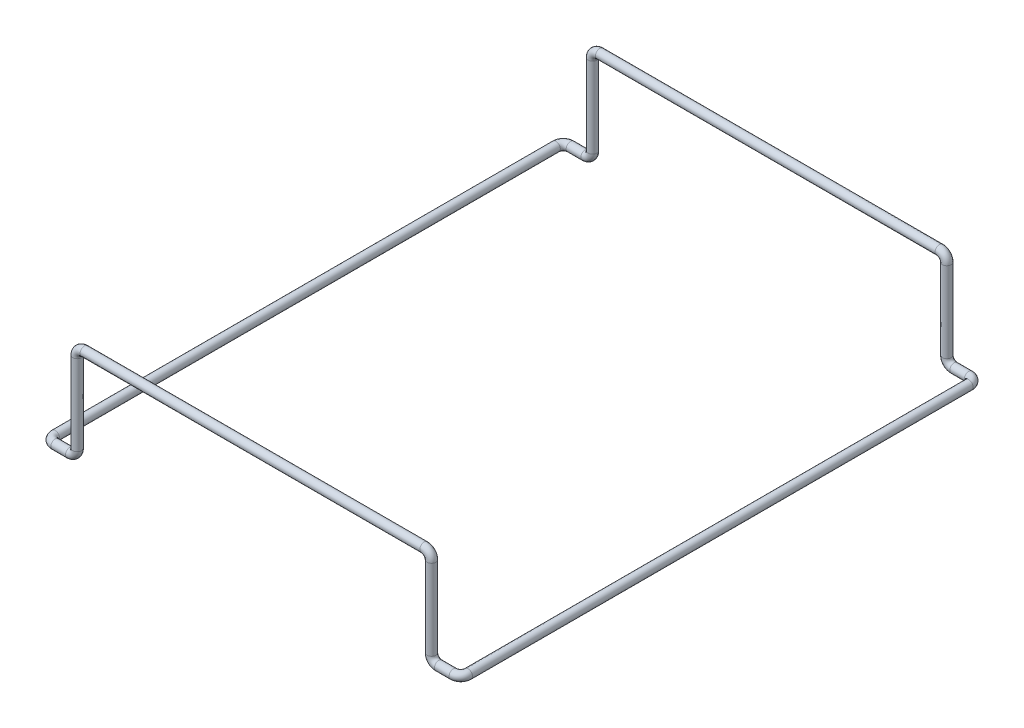
ISO-10303-21;
HEADER;
FILE_DESCRIPTION(('STEP AP214'),'2;1');
FILE_NAME('part.step','',(''),(''),'','','');
FILE_SCHEMA(('AUTOMOTIVE_DESIGN { 1 0 10303 214 1 1 1 1 }'));
ENDSEC;
DATA;
#1=APPLICATION_CONTEXT('core data for automotive mechanical design processes');
#2=APPLICATION_PROTOCOL_DEFINITION('international standard','automotive_design',2000,#1);
#3=PRODUCT_CONTEXT('',#1,'mechanical');
#4=PRODUCT('Part','Part','',(#3));
#5=PRODUCT_RELATED_PRODUCT_CATEGORY('part','',(#4));
#6=PRODUCT_DEFINITION_FORMATION('','',#4);
#7=PRODUCT_DEFINITION_CONTEXT('part definition',#1,'design');
#8=PRODUCT_DEFINITION('design','',#6,#7);
#9=PRODUCT_DEFINITION_SHAPE('','',#8);
#10=(LENGTH_UNIT() NAMED_UNIT(*) SI_UNIT(.MILLI.,.METRE.));
#11=(NAMED_UNIT(*) PLANE_ANGLE_UNIT() SI_UNIT($,.RADIAN.));
#12=(NAMED_UNIT(*) SI_UNIT($,.STERADIAN.) SOLID_ANGLE_UNIT());
#13=UNCERTAINTY_MEASURE_WITH_UNIT(LENGTH_MEASURE(1.E-05),#10,'distance_accuracy_value','');
#14=(GEOMETRIC_REPRESENTATION_CONTEXT(3) GLOBAL_UNCERTAINTY_ASSIGNED_CONTEXT((#13)) GLOBAL_UNIT_ASSIGNED_CONTEXT((#10,
#11,#12)) REPRESENTATION_CONTEXT('',''));
#15=CARTESIAN_POINT('',(0.,0.,0.));
#16=DIRECTION('',(0.,0.,1.));
#17=DIRECTION('',(1.,0.,0.));
#18=AXIS2_PLACEMENT_3D('',#15,#16,#17);
#19=CARTESIAN_POINT('',(282.,-1.3917721026699E-13,347.));
#20=DIRECTION('',(0.,0.,-1.));
#21=DIRECTION('',(0.,1.,0.));
#22=AXIS2_PLACEMENT_3D('',#19,#20,#21);
#23=CYLINDRICAL_SURFACE('',#22,2.99999999999999);
#24=CARTESIAN_POINT('',(282.,0.,5.));
#25=DIRECTION('',(0.,0.,-1.));
#26=DIRECTION('',(-1.,0.,0.));
#27=AXIS2_PLACEMENT_3D('',#24,#25,#26);
#28=CIRCLE('',#27,2.99999999999999);
#29=CARTESIAN_POINT('',(285.,0.,5.00000000000001));
#30=VERTEX_POINT('',#29);
#31=EDGE_CURVE('E138',#30,#30,#28,.T.);
#32=ORIENTED_EDGE('',*,*,#31,.F.);
#33=EDGE_LOOP('',(#32));
#34=FACE_BOUND('',#33,.T.);
#35=CARTESIAN_POINT('',(282.,0.,347.));
#36=DIRECTION('',(0.,0.,-1.));
#37=DIRECTION('',(-1.,0.,0.));
#38=AXIS2_PLACEMENT_3D('',#35,#36,#37);
#39=CIRCLE('',#38,2.99999999999999);
#40=CARTESIAN_POINT('',(285.,0.,347.));
#41=VERTEX_POINT('',#40);
#42=EDGE_CURVE('E10',#41,#41,#39,.T.);
#43=ORIENTED_EDGE('',*,*,#42,.T.);
#44=EDGE_LOOP('',(#43));
#45=FACE_BOUND('',#44,.T.);
#46=ADVANCED_FACE('F38',(#34,#45),#23,.T.);
#47=CARTESIAN_POINT('',(277.,0.,347.));
#48=DIRECTION('',(0.,1.,0.));
#49=DIRECTION('',(0.,0.,1.));
#50=AXIS2_PLACEMENT_3D('',#47,#48,#49);
#51=TOROIDAL_SURFACE('',#50,5.,2.99999999999999);
#52=CARTESIAN_POINT('',(277.,0.,352.));
#53=DIRECTION('',(1.,0.,0.));
#54=DIRECTION('',(0.,0.,-1.));
#55=AXIS2_PLACEMENT_3D('',#52,#53,#54);
#56=CIRCLE('',#55,2.99999999999999);
#57=CARTESIAN_POINT('',(277.,-1.42859144850817E-13,355.));
#58=VERTEX_POINT('',#57);
#59=EDGE_CURVE('E45',#58,#58,#56,.T.);
#60=CARTESIAN_POINT('',(277.,0.,347.));
#61=DIRECTION('',(0.,1.,0.));
#62=DIRECTION('',(0.,0.,1.));
#63=AXIS2_PLACEMENT_3D('',#60,#61,#62);
#64=CIRCLE('',#63,8.);
#65=EDGE_CURVE('',#58,#41,#64,.T.);
#66=ORIENTED_EDGE('',*,*,#59,.T.);
#67=ORIENTED_EDGE('',*,*,#42,.F.);
#68=ORIENTED_EDGE('',*,*,#65,.T.);
#69=ORIENTED_EDGE('',*,*,#65,.F.);
#70=EDGE_LOOP('',(#66,#68,#67,#69));
#71=FACE_BOUND('',#70,.T.);
#72=ADVANCED_FACE('F145',(#71),#51,.T.);
#73=CARTESIAN_POINT('',(267.,0.,352.));
#74=DIRECTION('',(1.,0.,0.));
#75=DIRECTION('',(0.,1.,0.));
#76=AXIS2_PLACEMENT_3D('',#73,#74,#75);
#77=CYLINDRICAL_SURFACE('',#76,2.99999999999999);
#78=ORIENTED_EDGE('',*,*,#59,.F.);
#79=EDGE_LOOP('',(#78));
#80=FACE_BOUND('',#79,.T.);
#81=CARTESIAN_POINT('',(267.,0.,352.));
#82=DIRECTION('',(1.,0.,0.));
#83=DIRECTION('',(0.,0.,-1.));
#84=AXIS2_PLACEMENT_3D('',#81,#82,#83);
#85=CIRCLE('',#84,2.99999999999999);
#86=CARTESIAN_POINT('',(267.,-3.00000000000005,352.));
#87=VERTEX_POINT('',#86);
#88=EDGE_CURVE('E51',#87,#87,#85,.T.);
#89=ORIENTED_EDGE('',*,*,#88,.T.);
#90=EDGE_LOOP('',(#89));
#91=FACE_BOUND('',#90,.T.);
#92=ADVANCED_FACE('F149',(#80,#91),#77,.T.);
#93=CARTESIAN_POINT('',(267.,5.,352.));
#94=DIRECTION('',(0.,0.,1.));
#95=DIRECTION('',(1.,0.,0.));
#96=AXIS2_PLACEMENT_3D('',#93,#94,#95);
#97=TOROIDAL_SURFACE('',#96,5.00000000000006,2.99999999999999);
#98=CARTESIAN_POINT('',(262.,5.,352.));
#99=DIRECTION('',(0.,-1.,0.));
#100=DIRECTION('',(0.,0.,-1.));
#101=AXIS2_PLACEMENT_3D('',#98,#99,#100);
#102=CIRCLE('',#101,2.99999999999999);
#103=CARTESIAN_POINT('',(259.,5.,352.));
#104=VERTEX_POINT('',#103);
#105=EDGE_CURVE('E58',#104,#104,#102,.T.);
#106=CARTESIAN_POINT('',(267.,5.,352.));
#107=DIRECTION('',(0.,0.,1.));
#108=DIRECTION('',(1.,0.,0.));
#109=AXIS2_PLACEMENT_3D('',#106,#107,#108);
#110=CIRCLE('',#109,8.00000000000005);
#111=EDGE_CURVE('',#104,#87,#110,.T.);
#112=ORIENTED_EDGE('',*,*,#105,.T.);
#113=ORIENTED_EDGE('',*,*,#88,.F.);
#114=ORIENTED_EDGE('',*,*,#111,.T.);
#115=ORIENTED_EDGE('',*,*,#111,.F.);
#116=EDGE_LOOP('',(#112,#114,#113,#115));
#117=FACE_BOUND('',#116,.T.);
#118=ADVANCED_FACE('F154',(#117),#97,.T.);
#119=CARTESIAN_POINT('',(262.,60.,352.));
#120=DIRECTION('',(0.,-1.,0.));
#121=DIRECTION('',(0.,0.,-1.));
#122=AXIS2_PLACEMENT_3D('',#119,#120,#121);
#123=CYLINDRICAL_SURFACE('',#122,2.99999999999999);
#124=ORIENTED_EDGE('',*,*,#105,.F.);
#125=EDGE_LOOP('',(#124));
#126=FACE_BOUND('',#125,.T.);
#127=CARTESIAN_POINT('',(262.,60.,352.));
#128=DIRECTION('',(0.,-1.,0.));
#129=DIRECTION('',(0.,0.,-1.));
#130=AXIS2_PLACEMENT_3D('',#127,#128,#129);
#131=CIRCLE('',#130,2.99999999999999);
#132=CARTESIAN_POINT('',(265.,60.,352.));
#133=VERTEX_POINT('',#132);
#134=EDGE_CURVE('E64',#133,#133,#131,.T.);
#135=ORIENTED_EDGE('',*,*,#134,.T.);
#136=EDGE_LOOP('',(#135));
#137=FACE_BOUND('',#136,.T.);
#138=ADVANCED_FACE('F160',(#126,#137),#123,.T.);
#139=CARTESIAN_POINT('',(257.,60.,352.));
#140=DIRECTION('',(0.,0.,-1.));
#141=DIRECTION('',(-1.,0.,0.));
#142=AXIS2_PLACEMENT_3D('',#139,#140,#141);
#143=TOROIDAL_SURFACE('',#142,4.9999999999999,2.99999999999999);
#144=CARTESIAN_POINT('',(257.,64.9999999999999,352.));
#145=DIRECTION('',(1.,0.,0.));
#146=DIRECTION('',(0.,0.,-1.));
#147=AXIS2_PLACEMENT_3D('',#144,#145,#146);
#148=CIRCLE('',#147,2.99999999999999);
#149=CARTESIAN_POINT('',(257.,67.9999999999999,352.));
#150=VERTEX_POINT('',#149);
#151=EDGE_CURVE('E68',#150,#150,#148,.T.);
#152=CARTESIAN_POINT('',(257.,60.,352.));
#153=DIRECTION('',(0.,0.,-1.));
#154=DIRECTION('',(-1.,0.,0.));
#155=AXIS2_PLACEMENT_3D('',#152,#153,#154);
#156=CIRCLE('',#155,7.99999999999989);
#157=EDGE_CURVE('',#150,#133,#156,.T.);
#158=ORIENTED_EDGE('',*,*,#151,.T.);
#159=ORIENTED_EDGE('',*,*,#134,.F.);
#160=ORIENTED_EDGE('',*,*,#157,.T.);
#161=ORIENTED_EDGE('',*,*,#157,.F.);
#162=EDGE_LOOP('',(#158,#160,#159,#161));
#163=FACE_BOUND('',#162,.T.);
#164=ADVANCED_FACE('F164',(#163),#143,.T.);
#165=CARTESIAN_POINT('',(25.,64.9999999999999,352.));
#166=DIRECTION('',(1.,0.,0.));
#167=DIRECTION('',(0.,0.,-1.));
#168=AXIS2_PLACEMENT_3D('',#165,#166,#167);
#169=CYLINDRICAL_SURFACE('',#168,2.99999999999999);
#170=ORIENTED_EDGE('',*,*,#151,.F.);
#171=EDGE_LOOP('',(#170));
#172=FACE_BOUND('',#171,.T.);
#173=CARTESIAN_POINT('',(25.,64.9999999999999,352.));
#174=DIRECTION('',(1.,0.,0.));
#175=DIRECTION('',(0.,0.,-1.));
#176=AXIS2_PLACEMENT_3D('',#173,#174,#175);
#177=CIRCLE('',#176,2.99999999999999);
#178=CARTESIAN_POINT('',(25.,67.9999999999999,352.));
#179=VERTEX_POINT('',#178);
#180=EDGE_CURVE('E72',#179,#179,#177,.T.);
#181=ORIENTED_EDGE('',*,*,#180,.T.);
#182=EDGE_LOOP('',(#181));
#183=FACE_BOUND('',#182,.T.);
#184=ADVANCED_FACE('F168',(#172,#183),#169,.T.);
#185=CARTESIAN_POINT('',(25.,60.,352.));
#186=DIRECTION('',(0.,0.,-1.));
#187=DIRECTION('',(-1.,0.,0.));
#188=AXIS2_PLACEMENT_3D('',#185,#186,#187);
#189=TOROIDAL_SURFACE('',#188,4.9999999999999,2.99999999999999);
#190=CARTESIAN_POINT('',(20.0000000000001,60.,352.));
#191=DIRECTION('',(0.,1.,0.));
#192=DIRECTION('',(0.,0.,-1.));
#193=AXIS2_PLACEMENT_3D('',#190,#191,#192);
#194=CIRCLE('',#193,2.99999999999999);
#195=CARTESIAN_POINT('',(17.0000000000001,60.,352.));
#196=VERTEX_POINT('',#195);
#197=EDGE_CURVE('E76',#196,#196,#194,.T.);
#198=CARTESIAN_POINT('',(25.,60.,352.));
#199=DIRECTION('',(0.,0.,-1.));
#200=DIRECTION('',(-1.,0.,0.));
#201=AXIS2_PLACEMENT_3D('',#198,#199,#200);
#202=CIRCLE('',#201,7.99999999999989);
#203=EDGE_CURVE('',#196,#179,#202,.T.);
#204=ORIENTED_EDGE('',*,*,#197,.T.);
#205=ORIENTED_EDGE('',*,*,#180,.F.);
#206=ORIENTED_EDGE('',*,*,#203,.T.);
#207=ORIENTED_EDGE('',*,*,#203,.F.);
#208=EDGE_LOOP('',(#204,#206,#205,#207));
#209=FACE_BOUND('',#208,.T.);
#210=ADVANCED_FACE('F172',(#209),#189,.T.);
#211=CARTESIAN_POINT('',(20.0000000000001,5.,352.));
#212=DIRECTION('',(0.,1.,0.));
#213=DIRECTION('',(0.,0.,1.));
#214=AXIS2_PLACEMENT_3D('',#211,#212,#213);
#215=CYLINDRICAL_SURFACE('',#214,2.99999999999999);
#216=ORIENTED_EDGE('',*,*,#197,.F.);
#217=EDGE_LOOP('',(#216));
#218=FACE_BOUND('',#217,.T.);
#219=CARTESIAN_POINT('',(20.0000000000001,5.,352.));
#220=DIRECTION('',(0.,1.,0.));
#221=DIRECTION('',(0.,0.,-1.));
#222=AXIS2_PLACEMENT_3D('',#219,#220,#221);
#223=CIRCLE('',#222,2.99999999999999);
#224=CARTESIAN_POINT('',(23.0000000000001,5.,352.));
#225=VERTEX_POINT('',#224);
#226=EDGE_CURVE('E80',#225,#225,#223,.T.);
#227=ORIENTED_EDGE('',*,*,#226,.T.);
#228=EDGE_LOOP('',(#227));
#229=FACE_BOUND('',#228,.T.);
#230=ADVANCED_FACE('F176',(#218,#229),#215,.T.);
#231=CARTESIAN_POINT('',(15.,5.,352.));
#232=DIRECTION('',(0.,0.,1.));
#233=DIRECTION('',(1.,0.,0.));
#234=AXIS2_PLACEMENT_3D('',#231,#232,#233);
#235=TOROIDAL_SURFACE('',#234,5.0000000000001,2.99999999999999);
#236=CARTESIAN_POINT('',(15.,0.,352.));
#237=DIRECTION('',(1.,0.,0.));
#238=DIRECTION('',(0.,0.,-1.));
#239=AXIS2_PLACEMENT_3D('',#236,#237,#238);
#240=CIRCLE('',#239,2.99999999999999);
#241=CARTESIAN_POINT('',(15.,-3.00000000000009,352.));
#242=VERTEX_POINT('',#241);
#243=EDGE_CURVE('E84',#242,#242,#240,.T.);
#244=CARTESIAN_POINT('',(15.,5.,352.));
#245=DIRECTION('',(0.,0.,1.));
#246=DIRECTION('',(1.,0.,0.));
#247=AXIS2_PLACEMENT_3D('',#244,#245,#246);
#248=CIRCLE('',#247,8.00000000000009);
#249=EDGE_CURVE('',#242,#225,#248,.T.);
#250=ORIENTED_EDGE('',*,*,#243,.T.);
#251=ORIENTED_EDGE('',*,*,#226,.F.);
#252=ORIENTED_EDGE('',*,*,#249,.T.);
#253=ORIENTED_EDGE('',*,*,#249,.F.);
#254=EDGE_LOOP('',(#250,#252,#251,#253));
#255=FACE_BOUND('',#254,.T.);
#256=ADVANCED_FACE('F180',(#255),#235,.T.);
#257=CARTESIAN_POINT('',(5.,0.,352.));
#258=DIRECTION('',(1.,0.,0.));
#259=DIRECTION('',(0.,0.,-1.));
#260=AXIS2_PLACEMENT_3D('',#257,#258,#259);
#261=CYLINDRICAL_SURFACE('',#260,2.99999999999999);
#262=ORIENTED_EDGE('',*,*,#243,.F.);
#263=EDGE_LOOP('',(#262));
#264=FACE_BOUND('',#263,.T.);
#265=CARTESIAN_POINT('',(5.,0.,352.));
#266=DIRECTION('',(1.,0.,0.));
#267=DIRECTION('',(0.,0.,-1.));
#268=AXIS2_PLACEMENT_3D('',#265,#266,#267);
#269=CIRCLE('',#268,2.99999999999999);
#270=CARTESIAN_POINT('',(5.,0.,355.));
#271=VERTEX_POINT('',#270);
#272=EDGE_CURVE('E88',#271,#271,#269,.T.);
#273=ORIENTED_EDGE('',*,*,#272,.T.);
#274=EDGE_LOOP('',(#273));
#275=FACE_BOUND('',#274,.T.);
#276=ADVANCED_FACE('F184',(#264,#275),#261,.T.);
#277=CARTESIAN_POINT('',(5.,0.,347.));
#278=DIRECTION('',(0.,1.,0.));
#279=DIRECTION('',(0.,0.,1.));
#280=AXIS2_PLACEMENT_3D('',#277,#278,#279);
#281=TOROIDAL_SURFACE('',#280,5.,2.99999999999999);
#282=CARTESIAN_POINT('',(0.,0.,347.));
#283=DIRECTION('',(0.,0.,1.));
#284=DIRECTION('',(1.,0.,0.));
#285=AXIS2_PLACEMENT_3D('',#282,#283,#284);
#286=CIRCLE('',#285,2.99999999999999);
#287=CARTESIAN_POINT('',(-2.99999999999999,0.,347.));
#288=VERTEX_POINT('',#287);
#289=EDGE_CURVE('E92',#288,#288,#286,.T.);
#290=CARTESIAN_POINT('',(5.,0.,347.));
#291=DIRECTION('',(0.,1.,0.));
#292=DIRECTION('',(0.,0.,1.));
#293=AXIS2_PLACEMENT_3D('',#290,#291,#292);
#294=CIRCLE('',#293,7.99999999999999);
#295=EDGE_CURVE('',#288,#271,#294,.T.);
#296=ORIENTED_EDGE('',*,*,#289,.T.);
#297=ORIENTED_EDGE('',*,*,#272,.F.);
#298=ORIENTED_EDGE('',*,*,#295,.T.);
#299=ORIENTED_EDGE('',*,*,#295,.F.);
#300=EDGE_LOOP('',(#296,#298,#297,#299));
#301=FACE_BOUND('',#300,.T.);
#302=ADVANCED_FACE('F188',(#301),#281,.T.);
#303=CARTESIAN_POINT('',(0.,0.,5.));
#304=DIRECTION('',(0.,0.,1.));
#305=DIRECTION('',(1.,0.,0.));
#306=AXIS2_PLACEMENT_3D('',#303,#304,#305);
#307=CYLINDRICAL_SURFACE('',#306,2.99999999999999);
#308=ORIENTED_EDGE('',*,*,#289,.F.);
#309=EDGE_LOOP('',(#308));
#310=FACE_BOUND('',#309,.T.);
#311=CARTESIAN_POINT('',(0.,0.,5.));
#312=DIRECTION('',(0.,0.,1.));
#313=DIRECTION('',(1.,0.,0.));
#314=AXIS2_PLACEMENT_3D('',#311,#312,#313);
#315=CIRCLE('',#314,2.99999999999999);
#316=CARTESIAN_POINT('',(-2.99999999999999,0.,5.));
#317=VERTEX_POINT('',#316);
#318=EDGE_CURVE('E96',#317,#317,#315,.T.);
#319=ORIENTED_EDGE('',*,*,#318,.T.);
#320=EDGE_LOOP('',(#319));
#321=FACE_BOUND('',#320,.T.);
#322=ADVANCED_FACE('F192',(#310,#321),#307,.T.);
#323=CARTESIAN_POINT('',(5.,0.,5.));
#324=DIRECTION('',(0.,1.,0.));
#325=DIRECTION('',(0.,0.,1.));
#326=AXIS2_PLACEMENT_3D('',#323,#324,#325);
#327=TOROIDAL_SURFACE('',#326,5.,2.99999999999999);
#328=CARTESIAN_POINT('',(5.,0.,0.));
#329=DIRECTION('',(-1.,0.,0.));
#330=DIRECTION('',(0.,0.,1.));
#331=AXIS2_PLACEMENT_3D('',#328,#329,#330);
#332=CIRCLE('',#331,2.99999999999999);
#333=CARTESIAN_POINT('',(5.,0.,-2.99999999999999));
#334=VERTEX_POINT('',#333);
#335=EDGE_CURVE('E100',#334,#334,#332,.T.);
#336=CARTESIAN_POINT('',(5.,0.,5.));
#337=DIRECTION('',(0.,1.,0.));
#338=DIRECTION('',(0.,0.,1.));
#339=AXIS2_PLACEMENT_3D('',#336,#337,#338);
#340=CIRCLE('',#339,7.99999999999999);
#341=EDGE_CURVE('',#334,#317,#340,.T.);
#342=ORIENTED_EDGE('',*,*,#335,.T.);
#343=ORIENTED_EDGE('',*,*,#318,.F.);
#344=ORIENTED_EDGE('',*,*,#341,.T.);
#345=ORIENTED_EDGE('',*,*,#341,.F.);
#346=EDGE_LOOP('',(#342,#344,#343,#345));
#347=FACE_BOUND('',#346,.T.);
#348=ADVANCED_FACE('F196',(#347),#327,.T.);
#349=CARTESIAN_POINT('',(15.,0.,0.));
#350=DIRECTION('',(-1.,0.,0.));
#351=DIRECTION('',(0.,0.,1.));
#352=AXIS2_PLACEMENT_3D('',#349,#350,#351);
#353=CYLINDRICAL_SURFACE('',#352,2.99999999999999);
#354=ORIENTED_EDGE('',*,*,#335,.F.);
#355=EDGE_LOOP('',(#354));
#356=FACE_BOUND('',#355,.T.);
#357=CARTESIAN_POINT('',(15.,0.,0.));
#358=DIRECTION('',(-1.,0.,0.));
#359=DIRECTION('',(0.,0.,1.));
#360=AXIS2_PLACEMENT_3D('',#357,#358,#359);
#361=CIRCLE('',#360,2.99999999999999);
#362=CARTESIAN_POINT('',(15.,-3.00000000000009,0.));
#363=VERTEX_POINT('',#362);
#364=EDGE_CURVE('E104',#363,#363,#361,.T.);
#365=ORIENTED_EDGE('',*,*,#364,.T.);
#366=EDGE_LOOP('',(#365));
#367=FACE_BOUND('',#366,.T.);
#368=ADVANCED_FACE('F200',(#356,#367),#353,.T.);
#369=CARTESIAN_POINT('',(15.,5.,0.));
#370=DIRECTION('',(0.,0.,-1.));
#371=DIRECTION('',(-1.,0.,0.));
#372=AXIS2_PLACEMENT_3D('',#369,#370,#371);
#373=TOROIDAL_SURFACE('',#372,5.0000000000001,2.99999999999999);
#374=CARTESIAN_POINT('',(20.0000000000001,5.,0.));
#375=DIRECTION('',(0.,-1.,0.));
#376=DIRECTION('',(0.,0.,1.));
#377=AXIS2_PLACEMENT_3D('',#374,#375,#376);
#378=CIRCLE('',#377,2.99999999999999);
#379=CARTESIAN_POINT('',(23.0000000000001,5.,0.));
#380=VERTEX_POINT('',#379);
#381=EDGE_CURVE('E108',#380,#380,#378,.T.);
#382=CARTESIAN_POINT('',(15.,5.,0.));
#383=DIRECTION('',(0.,0.,-1.));
#384=DIRECTION('',(-1.,0.,0.));
#385=AXIS2_PLACEMENT_3D('',#382,#383,#384);
#386=CIRCLE('',#385,8.00000000000009);
#387=EDGE_CURVE('',#380,#363,#386,.T.);
#388=ORIENTED_EDGE('',*,*,#381,.T.);
#389=ORIENTED_EDGE('',*,*,#364,.F.);
#390=ORIENTED_EDGE('',*,*,#387,.T.);
#391=ORIENTED_EDGE('',*,*,#387,.F.);
#392=EDGE_LOOP('',(#388,#390,#389,#391));
#393=FACE_BOUND('',#392,.T.);
#394=ADVANCED_FACE('F204',(#393),#373,.T.);
#395=CARTESIAN_POINT('',(20.0000000000001,60.,0.));
#396=DIRECTION('',(0.,-1.,0.));
#397=DIRECTION('',(0.,0.,-1.));
#398=AXIS2_PLACEMENT_3D('',#395,#396,#397);
#399=CYLINDRICAL_SURFACE('',#398,2.99999999999999);
#400=ORIENTED_EDGE('',*,*,#381,.F.);
#401=EDGE_LOOP('',(#400));
#402=FACE_BOUND('',#401,.T.);
#403=CARTESIAN_POINT('',(20.0000000000001,60.,0.));
#404=DIRECTION('',(0.,-1.,0.));
#405=DIRECTION('',(0.,0.,1.));
#406=AXIS2_PLACEMENT_3D('',#403,#404,#405);
#407=CIRCLE('',#406,2.99999999999999);
#408=CARTESIAN_POINT('',(17.0000000000001,60.,0.));
#409=VERTEX_POINT('',#408);
#410=EDGE_CURVE('E112',#409,#409,#407,.T.);
#411=ORIENTED_EDGE('',*,*,#410,.T.);
#412=EDGE_LOOP('',(#411));
#413=FACE_BOUND('',#412,.T.);
#414=ADVANCED_FACE('F208',(#402,#413),#399,.T.);
#415=CARTESIAN_POINT('',(25.,60.,0.));
#416=DIRECTION('',(0.,0.,1.));
#417=DIRECTION('',(1.,0.,0.));
#418=AXIS2_PLACEMENT_3D('',#415,#416,#417);
#419=TOROIDAL_SURFACE('',#418,4.9999999999999,2.99999999999999);
#420=CARTESIAN_POINT('',(25.,64.9999999999999,0.));
#421=DIRECTION('',(-1.,0.,0.));
#422=DIRECTION('',(0.,0.,1.));
#423=AXIS2_PLACEMENT_3D('',#420,#421,#422);
#424=CIRCLE('',#423,2.99999999999999);
#425=CARTESIAN_POINT('',(25.,67.9999999999999,0.));
#426=VERTEX_POINT('',#425);
#427=EDGE_CURVE('E115',#426,#426,#424,.T.);
#428=CARTESIAN_POINT('',(25.,60.,0.));
#429=DIRECTION('',(0.,0.,1.));
#430=DIRECTION('',(1.,0.,0.));
#431=AXIS2_PLACEMENT_3D('',#428,#429,#430);
#432=CIRCLE('',#431,7.99999999999989);
#433=EDGE_CURVE('',#426,#409,#432,.T.);
#434=ORIENTED_EDGE('',*,*,#427,.T.);
#435=ORIENTED_EDGE('',*,*,#410,.F.);
#436=ORIENTED_EDGE('',*,*,#433,.T.);
#437=ORIENTED_EDGE('',*,*,#433,.F.);
#438=EDGE_LOOP('',(#434,#436,#435,#437));
#439=FACE_BOUND('',#438,.T.);
#440=ADVANCED_FACE('F212',(#439),#419,.T.);
#441=CARTESIAN_POINT('',(257.,64.9999999999999,0.));
#442=DIRECTION('',(-1.,0.,0.));
#443=DIRECTION('',(0.,0.,1.));
#444=AXIS2_PLACEMENT_3D('',#441,#442,#443);
#445=CYLINDRICAL_SURFACE('',#444,2.99999999999999);
#446=ORIENTED_EDGE('',*,*,#427,.F.);
#447=EDGE_LOOP('',(#446));
#448=FACE_BOUND('',#447,.T.);
#449=CARTESIAN_POINT('',(257.,64.9999999999999,0.));
#450=DIRECTION('',(-1.,0.,0.));
#451=DIRECTION('',(0.,0.,1.));
#452=AXIS2_PLACEMENT_3D('',#449,#450,#451);
#453=CIRCLE('',#452,2.99999999999999);
#454=CARTESIAN_POINT('',(257.,67.9999999999999,0.));
#455=VERTEX_POINT('',#454);
#456=EDGE_CURVE('E119',#455,#455,#453,.T.);
#457=ORIENTED_EDGE('',*,*,#456,.T.);
#458=EDGE_LOOP('',(#457));
#459=FACE_BOUND('',#458,.T.);
#460=ADVANCED_FACE('F216',(#448,#459),#445,.T.);
#461=CARTESIAN_POINT('',(257.,60.,0.));
#462=DIRECTION('',(0.,0.,1.));
#463=DIRECTION('',(1.,0.,0.));
#464=AXIS2_PLACEMENT_3D('',#461,#462,#463);
#465=TOROIDAL_SURFACE('',#464,4.99999999999995,2.99999999999999);
#466=CARTESIAN_POINT('',(262.,60.,0.));
#467=DIRECTION('',(0.,1.,0.));
#468=DIRECTION('',(0.,0.,1.));
#469=AXIS2_PLACEMENT_3D('',#466,#467,#468);
#470=CIRCLE('',#469,2.99999999999999);
#471=CARTESIAN_POINT('',(265.,60.,0.));
#472=VERTEX_POINT('',#471);
#473=EDGE_CURVE('E122',#472,#472,#470,.T.);
#474=CARTESIAN_POINT('',(257.,60.,0.));
#475=DIRECTION('',(0.,0.,1.));
#476=DIRECTION('',(1.,0.,0.));
#477=AXIS2_PLACEMENT_3D('',#474,#475,#476);
#478=CIRCLE('',#477,7.99999999999994);
#479=EDGE_CURVE('',#472,#455,#478,.T.);
#480=ORIENTED_EDGE('',*,*,#473,.T.);
#481=ORIENTED_EDGE('',*,*,#456,.F.);
#482=ORIENTED_EDGE('',*,*,#479,.T.);
#483=ORIENTED_EDGE('',*,*,#479,.F.);
#484=EDGE_LOOP('',(#480,#482,#481,#483));
#485=FACE_BOUND('',#484,.T.);
#486=ADVANCED_FACE('F220',(#485),#465,.T.);
#487=CARTESIAN_POINT('',(262.,5.,0.));
#488=DIRECTION('',(0.,1.,0.));
#489=DIRECTION('',(0.,0.,1.));
#490=AXIS2_PLACEMENT_3D('',#487,#488,#489);
#491=CYLINDRICAL_SURFACE('',#490,2.99999999999999);
#492=ORIENTED_EDGE('',*,*,#473,.F.);
#493=EDGE_LOOP('',(#492));
#494=FACE_BOUND('',#493,.T.);
#495=CARTESIAN_POINT('',(262.,5.,0.));
#496=DIRECTION('',(0.,1.,0.));
#497=DIRECTION('',(0.,0.,1.));
#498=AXIS2_PLACEMENT_3D('',#495,#496,#497);
#499=CIRCLE('',#498,2.99999999999999);
#500=CARTESIAN_POINT('',(259.,4.99999999999999,0.));
#501=VERTEX_POINT('',#500);
#502=EDGE_CURVE('E126',#501,#501,#499,.T.);
#503=ORIENTED_EDGE('',*,*,#502,.T.);
#504=EDGE_LOOP('',(#503));
#505=FACE_BOUND('',#504,.T.);
#506=ADVANCED_FACE('F224',(#494,#505),#491,.T.);
#507=CARTESIAN_POINT('',(267.,5.,0.));
#508=DIRECTION('',(0.,0.,-1.));
#509=DIRECTION('',(-1.,0.,0.));
#510=AXIS2_PLACEMENT_3D('',#507,#508,#509);
#511=TOROIDAL_SURFACE('',#510,5.0000000000001,2.99999999999999);
#512=CARTESIAN_POINT('',(267.,0.,0.));
#513=DIRECTION('',(-1.,0.,0.));
#514=DIRECTION('',(0.,0.,1.));
#515=AXIS2_PLACEMENT_3D('',#512,#513,#514);
#516=CIRCLE('',#515,2.99999999999999);
#517=CARTESIAN_POINT('',(267.,-3.00000000000009,0.));
#518=VERTEX_POINT('',#517);
#519=EDGE_CURVE('E130',#518,#518,#516,.T.);
#520=CARTESIAN_POINT('',(267.,5.,0.));
#521=DIRECTION('',(0.,0.,-1.));
#522=DIRECTION('',(-1.,0.,0.));
#523=AXIS2_PLACEMENT_3D('',#520,#521,#522);
#524=CIRCLE('',#523,8.00000000000009);
#525=EDGE_CURVE('',#518,#501,#524,.T.);
#526=ORIENTED_EDGE('',*,*,#519,.T.);
#527=ORIENTED_EDGE('',*,*,#502,.F.);
#528=ORIENTED_EDGE('',*,*,#525,.T.);
#529=ORIENTED_EDGE('',*,*,#525,.F.);
#530=EDGE_LOOP('',(#526,#528,#527,#529));
#531=FACE_BOUND('',#530,.T.);
#532=ADVANCED_FACE('F228',(#531),#511,.T.);
#533=CARTESIAN_POINT('',(277.,0.,0.));
#534=DIRECTION('',(-1.,0.,0.));
#535=DIRECTION('',(0.,-1.,0.));
#536=AXIS2_PLACEMENT_3D('',#533,#534,#535);
#537=CYLINDRICAL_SURFACE('',#536,2.99999999999999);
#538=ORIENTED_EDGE('',*,*,#519,.F.);
#539=EDGE_LOOP('',(#538));
#540=FACE_BOUND('',#539,.T.);
#541=CARTESIAN_POINT('',(277.,0.,0.));
#542=DIRECTION('',(-1.,0.,0.));
#543=DIRECTION('',(0.,0.,1.));
#544=AXIS2_PLACEMENT_3D('',#541,#542,#543);
#545=CIRCLE('',#544,2.99999999999999);
#546=CARTESIAN_POINT('',(277.,0.,-3.));
#547=VERTEX_POINT('',#546);
#548=EDGE_CURVE('E134',#547,#547,#545,.T.);
#549=ORIENTED_EDGE('',*,*,#548,.T.);
#550=EDGE_LOOP('',(#549));
#551=FACE_BOUND('',#550,.T.);
#552=ADVANCED_FACE('F232',(#540,#551),#537,.T.);
#553=CARTESIAN_POINT('',(277.,0.,5.));
#554=DIRECTION('',(0.,1.,0.));
#555=DIRECTION('',(0.,0.,1.));
#556=AXIS2_PLACEMENT_3D('',#553,#554,#555);
#557=TOROIDAL_SURFACE('',#556,5.,2.99999999999999);
#558=CARTESIAN_POINT('',(277.,0.,5.));
#559=DIRECTION('',(0.,1.,0.));
#560=DIRECTION('',(0.,0.,1.));
#561=AXIS2_PLACEMENT_3D('',#558,#559,#560);
#562=CIRCLE('',#561,8.);
#563=EDGE_CURVE('',#30,#547,#562,.T.);
#564=ORIENTED_EDGE('',*,*,#31,.T.);
#565=ORIENTED_EDGE('',*,*,#548,.F.);
#566=ORIENTED_EDGE('',*,*,#563,.T.);
#567=ORIENTED_EDGE('',*,*,#563,.F.);
#568=EDGE_LOOP('',(#564,#566,#565,#567));
#569=FACE_BOUND('',#568,.T.);
#570=ADVANCED_FACE('F142',(#569),#557,.T.);
#571=CLOSED_SHELL('',(#46,#72,#92,#118,#138,#164,#184,#210,#230,#256,#276,#302,#322,#348,#368,
#394,#414,#440,#460,#486,#506,#532,#552,#570));
#572=MANIFOLD_SOLID_BREP('B2',#571);
#573=ADVANCED_BREP_SHAPE_REPRESENTATION('',(#18,#572),#14);
#574=SHAPE_DEFINITION_REPRESENTATION(#9,#573);
ENDSEC;
END-ISO-10303-21;
